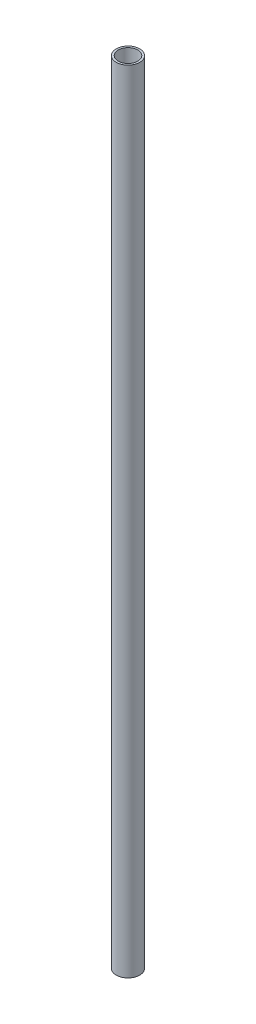
ISO-10303-21;
HEADER;
FILE_DESCRIPTION(('STEP AP214'),'2;1');
FILE_NAME('part.step','',(''),(''),'','','');
FILE_SCHEMA(('AUTOMOTIVE_DESIGN { 1 0 10303 214 1 1 1 1 }'));
ENDSEC;
DATA;
#1=APPLICATION_CONTEXT('core data for automotive mechanical design processes');
#2=APPLICATION_PROTOCOL_DEFINITION('international standard','automotive_design',2000,#1);
#3=PRODUCT_CONTEXT('',#1,'mechanical');
#4=PRODUCT('Part','Part','',(#3));
#5=PRODUCT_RELATED_PRODUCT_CATEGORY('part','',(#4));
#6=PRODUCT_DEFINITION_FORMATION('','',#4);
#7=PRODUCT_DEFINITION_CONTEXT('part definition',#1,'design');
#8=PRODUCT_DEFINITION('design','',#6,#7);
#9=PRODUCT_DEFINITION_SHAPE('','',#8);
#10=(LENGTH_UNIT() NAMED_UNIT(*) SI_UNIT(.MILLI.,.METRE.));
#11=(NAMED_UNIT(*) PLANE_ANGLE_UNIT() SI_UNIT($,.RADIAN.));
#12=(NAMED_UNIT(*) SI_UNIT($,.STERADIAN.) SOLID_ANGLE_UNIT());
#13=UNCERTAINTY_MEASURE_WITH_UNIT(LENGTH_MEASURE(1.E-05),#10,'distance_accuracy_value','');
#14=(GEOMETRIC_REPRESENTATION_CONTEXT(3) GLOBAL_UNCERTAINTY_ASSIGNED_CONTEXT((#13)) GLOBAL_UNIT_ASSIGNED_CONTEXT((#10,
#11,#12)) REPRESENTATION_CONTEXT('',''));
#15=CARTESIAN_POINT('',(0.,0.,0.));
#16=DIRECTION('',(0.,0.,1.));
#17=DIRECTION('',(1.,0.,0.));
#18=AXIS2_PLACEMENT_3D('',#15,#16,#17);
#19=CARTESIAN_POINT('',(0.,810.,0.));
#20=DIRECTION('',(0.,1.,0.));
#21=DIRECTION('',(0.,0.,1.));
#22=AXIS2_PLACEMENT_3D('',#19,#20,#21);
#23=PLANE('',#22);
#24=CARTESIAN_POINT('',(0.,810.,0.));
#25=DIRECTION('',(0.,1.,0.));
#26=DIRECTION('',(0.,0.,1.));
#27=AXIS2_PLACEMENT_3D('',#24,#25,#26);
#28=CIRCLE('',#27,12.);
#29=CARTESIAN_POINT('',(0.,810.,12.));
#30=VERTEX_POINT('',#29);
#31=EDGE_CURVE('E10',#30,#30,#28,.T.);
#32=ORIENTED_EDGE('',*,*,#31,.T.);
#33=EDGE_LOOP('',(#32));
#34=FACE_BOUND('',#33,.T.);
#35=CARTESIAN_POINT('',(0.,810.,0.));
#36=DIRECTION('',(0.,1.,0.));
#37=DIRECTION('',(0.,0.,1.));
#38=AXIS2_PLACEMENT_3D('',#35,#36,#37);
#39=CIRCLE('',#38,10.);
#40=CARTESIAN_POINT('',(0.,810.,10.));
#41=VERTEX_POINT('',#40);
#42=EDGE_CURVE('E41',#41,#41,#39,.T.);
#43=ORIENTED_EDGE('',*,*,#42,.F.);
#44=EDGE_LOOP('',(#43));
#45=FACE_BOUND('',#44,.T.);
#46=ADVANCED_FACE('F30',(#34,#45),#23,.T.);
#47=CARTESIAN_POINT('',(0.,0.,0.));
#48=DIRECTION('',(0.,1.,0.));
#49=DIRECTION('',(0.,0.,1.));
#50=AXIS2_PLACEMENT_3D('',#47,#48,#49);
#51=PLANE('',#50);
#52=CARTESIAN_POINT('',(0.,0.,0.));
#53=DIRECTION('',(0.,1.,0.));
#54=DIRECTION('',(0.,0.,1.));
#55=AXIS2_PLACEMENT_3D('',#52,#53,#54);
#56=CIRCLE('',#55,12.);
#57=CARTESIAN_POINT('',(0.,0.,12.));
#58=VERTEX_POINT('',#57);
#59=EDGE_CURVE('E34',#58,#58,#56,.T.);
#60=ORIENTED_EDGE('',*,*,#59,.F.);
#61=EDGE_LOOP('',(#60));
#62=FACE_BOUND('',#61,.T.);
#63=CARTESIAN_POINT('',(0.,0.,0.));
#64=DIRECTION('',(0.,1.,0.));
#65=DIRECTION('',(0.,0.,1.));
#66=AXIS2_PLACEMENT_3D('',#63,#64,#65);
#67=CIRCLE('',#66,10.);
#68=CARTESIAN_POINT('',(0.,0.,10.));
#69=VERTEX_POINT('',#68);
#70=EDGE_CURVE('E43',#69,#69,#67,.T.);
#71=ORIENTED_EDGE('',*,*,#70,.T.);
#72=EDGE_LOOP('',(#71));
#73=FACE_BOUND('',#72,.T.);
#74=ADVANCED_FACE('F53',(#62,#73),#51,.F.);
#75=CARTESIAN_POINT('',(0.,810.,0.));
#76=DIRECTION('',(0.,-1.,0.));
#77=DIRECTION('',(0.,0.,-1.));
#78=AXIS2_PLACEMENT_3D('',#75,#76,#77);
#79=CYLINDRICAL_SURFACE('',#78,12.);
#80=ORIENTED_EDGE('',*,*,#31,.F.);
#81=EDGE_LOOP('',(#80));
#82=FACE_BOUND('',#81,.T.);
#83=ORIENTED_EDGE('',*,*,#59,.T.);
#84=EDGE_LOOP('',(#83));
#85=FACE_BOUND('',#84,.T.);
#86=ADVANCED_FACE('F32',(#82,#85),#79,.T.);
#87=CARTESIAN_POINT('',(0.,810.,0.));
#88=DIRECTION('',(0.,-1.,0.));
#89=DIRECTION('',(0.,0.,-1.));
#90=AXIS2_PLACEMENT_3D('',#87,#88,#89);
#91=CYLINDRICAL_SURFACE('',#90,10.);
#92=ORIENTED_EDGE('',*,*,#42,.T.);
#93=EDGE_LOOP('',(#92));
#94=FACE_BOUND('',#93,.T.);
#95=ORIENTED_EDGE('',*,*,#70,.F.);
#96=EDGE_LOOP('',(#95));
#97=FACE_BOUND('',#96,.T.);
#98=ADVANCED_FACE('F49',(#94,#97),#91,.F.);
#99=CLOSED_SHELL('',(#46,#74,#86,#98));
#100=MANIFOLD_SOLID_BREP('B2',#99);
#101=ADVANCED_BREP_SHAPE_REPRESENTATION('',(#18,#100),#14);
#102=SHAPE_DEFINITION_REPRESENTATION(#9,#101);
ENDSEC;
END-ISO-10303-21;
